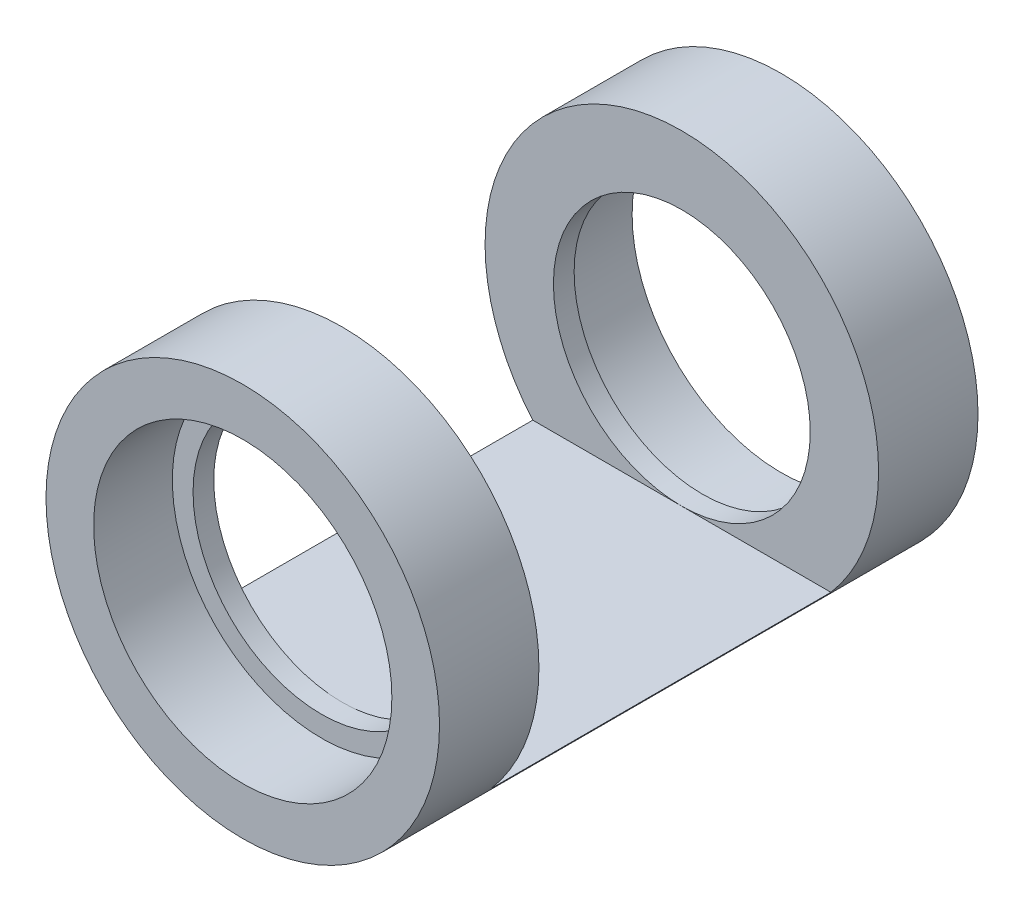
ISO-10303-21;
HEADER;
FILE_DESCRIPTION(('STEP AP214'),'2;1');
FILE_NAME('part.step','',(''),(''),'','','');
FILE_SCHEMA(('AUTOMOTIVE_DESIGN { 1 0 10303 214 1 1 1 1 }'));
ENDSEC;
DATA;
#1=APPLICATION_CONTEXT('core data for automotive mechanical design processes');
#2=APPLICATION_PROTOCOL_DEFINITION('international standard','automotive_design',2000,#1);
#3=PRODUCT_CONTEXT('',#1,'mechanical');
#4=PRODUCT('Part','Part','',(#3));
#5=PRODUCT_RELATED_PRODUCT_CATEGORY('part','',(#4));
#6=PRODUCT_DEFINITION_FORMATION('','',#4);
#7=PRODUCT_DEFINITION_CONTEXT('part definition',#1,'design');
#8=PRODUCT_DEFINITION('design','',#6,#7);
#9=PRODUCT_DEFINITION_SHAPE('','',#8);
#10=(LENGTH_UNIT() NAMED_UNIT(*) SI_UNIT(.MILLI.,.METRE.));
#11=(NAMED_UNIT(*) PLANE_ANGLE_UNIT() SI_UNIT($,.RADIAN.));
#12=(NAMED_UNIT(*) SI_UNIT($,.STERADIAN.) SOLID_ANGLE_UNIT());
#13=UNCERTAINTY_MEASURE_WITH_UNIT(LENGTH_MEASURE(1.E-05),#10,'distance_accuracy_value','');
#14=(GEOMETRIC_REPRESENTATION_CONTEXT(3) GLOBAL_UNCERTAINTY_ASSIGNED_CONTEXT((#13)) GLOBAL_UNIT_ASSIGNED_CONTEXT((#10,
#11,#12)) REPRESENTATION_CONTEXT('',''));
#15=CARTESIAN_POINT('',(0.,0.,0.));
#16=DIRECTION('',(0.,0.,1.));
#17=DIRECTION('',(1.,0.,0.));
#18=AXIS2_PLACEMENT_3D('',#15,#16,#17);
#19=CARTESIAN_POINT('',(0.,0.,65.));
#20=DIRECTION('',(0.,0.,-1.));
#21=DIRECTION('',(-1.,0.,0.));
#22=AXIS2_PLACEMENT_3D('',#19,#20,#21);
#23=CYLINDRICAL_SURFACE('',#22,31.);
#24=CARTESIAN_POINT('',(0.,0.,41.));
#25=DIRECTION('',(0.,0.,1.));
#26=DIRECTION('',(1.,0.,0.));
#27=AXIS2_PLACEMENT_3D('',#24,#25,#26);
#28=CIRCLE('',#27,31.);
#29=CARTESIAN_POINT('',(0.,-31.,41.));
#30=VERTEX_POINT('',#29);
#31=EDGE_CURVE('E57',#30,#30,#28,.T.);
#32=ORIENTED_EDGE('',*,*,#31,.F.);
#33=EDGE_LOOP('',(#32));
#34=FACE_BOUND('',#33,.T.);
#35=CARTESIAN_POINT('',(0.,0.,46.));
#36=DIRECTION('',(0.,0.,1.));
#37=DIRECTION('',(1.,0.,0.));
#38=AXIS2_PLACEMENT_3D('',#35,#36,#37);
#39=CIRCLE('',#38,31.);
#40=CARTESIAN_POINT('',(31.,0.,46.));
#41=VERTEX_POINT('',#40);
#42=EDGE_CURVE('E41',#41,#41,#39,.F.);
#43=ORIENTED_EDGE('',*,*,#42,.F.);
#44=EDGE_LOOP('',(#43));
#45=FACE_BOUND('',#44,.T.);
#46=ADVANCED_FACE('F37',(#34,#45),#23,.F.);
#47=CARTESIAN_POINT('',(0.,0.,65.));
#48=DIRECTION('',(0.,0.,-1.));
#49=DIRECTION('',(-1.,0.,0.));
#50=AXIS2_PLACEMENT_3D('',#47,#48,#49);
#51=CYLINDRICAL_SURFACE('',#50,47.5);
#52=CARTESIAN_POINT('',(0.,0.,-65.));
#53=DIRECTION('',(0.,0.,1.));
#54=DIRECTION('',(1.,0.,0.));
#55=AXIS2_PLACEMENT_3D('',#52,#53,#54);
#56=CIRCLE('',#55,47.5);
#57=CARTESIAN_POINT('',(47.5,0.,-65.));
#58=VERTEX_POINT('',#57);
#59=EDGE_CURVE('E46',#58,#58,#56,.T.);
#60=ORIENTED_EDGE('',*,*,#59,.T.);
#61=EDGE_LOOP('',(#60));
#62=FACE_BOUND('',#61,.T.);
#63=CARTESIAN_POINT('',(0.,0.,65.));
#64=DIRECTION('',(0.,0.,1.));
#65=DIRECTION('',(1.,0.,0.));
#66=AXIS2_PLACEMENT_3D('',#63,#64,#65);
#67=CIRCLE('',#66,47.5);
#68=CARTESIAN_POINT('',(47.5,0.,65.));
#69=VERTEX_POINT('',#68);
#70=EDGE_CURVE('E11',#69,#69,#67,.T.);
#71=ORIENTED_EDGE('',*,*,#70,.F.);
#72=EDGE_LOOP('',(#71));
#73=FACE_BOUND('',#72,.T.);
#74=CARTESIAN_POINT('',(0.,0.,-41.));
#75=DIRECTION('',(0.,0.,1.));
#76=DIRECTION('',(1.,0.,0.));
#77=AXIS2_PLACEMENT_3D('',#74,#75,#76);
#78=CIRCLE('',#77,47.5);
#79=CARTESIAN_POINT('',(35.9895818258562,-31.,-41.));
#80=VERTEX_POINT('',#79);
#81=CARTESIAN_POINT('',(-35.9895818258562,-31.,-41.));
#82=VERTEX_POINT('',#81);
#83=EDGE_CURVE('E72',#80,#82,#78,.T.);
#84=ORIENTED_EDGE('',*,*,#83,.F.);
#85=DIRECTION('',(0.,0.,1.));
#86=VECTOR('',#85,1.);
#87=CARTESIAN_POINT('',(35.9895818258562,-31.,-41.));
#88=LINE('',#87,#86);
#89=CARTESIAN_POINT('',(35.9895818258562,-31.,41.));
#90=VERTEX_POINT('',#89);
#91=EDGE_CURVE('E93',#80,#90,#88,.T.);
#92=ORIENTED_EDGE('',*,*,#91,.T.);
#93=CARTESIAN_POINT('',(0.,0.,41.));
#94=DIRECTION('',(0.,0.,1.));
#95=DIRECTION('',(1.,0.,0.));
#96=AXIS2_PLACEMENT_3D('',#93,#94,#95);
#97=CIRCLE('',#96,47.5);
#98=CARTESIAN_POINT('',(-35.9895818258562,-31.,41.));
#99=VERTEX_POINT('',#98);
#100=EDGE_CURVE('E92',#90,#99,#97,.T.);
#101=ORIENTED_EDGE('',*,*,#100,.T.);
#102=DIRECTION('',(0.,0.,1.));
#103=VECTOR('',#102,1.);
#104=CARTESIAN_POINT('',(-35.9895818258562,-31.,-41.));
#105=LINE('',#104,#103);
#106=EDGE_CURVE('E88',#82,#99,#105,.T.);
#107=ORIENTED_EDGE('',*,*,#106,.F.);
#108=EDGE_LOOP('',(#84,#92,#101,#107));
#109=FACE_BOUND('',#108,.T.);
#110=ADVANCED_FACE('F39',(#62,#73,#109),#51,.T.);
#111=CARTESIAN_POINT('',(0.,0.,65.));
#112=DIRECTION('',(0.,0.,1.));
#113=DIRECTION('',(1.,0.,0.));
#114=AXIS2_PLACEMENT_3D('',#111,#112,#113);
#115=PLANE('',#114);
#116=CARTESIAN_POINT('',(0.,0.,65.));
#117=DIRECTION('',(0.,0.,1.));
#118=DIRECTION('',(1.,0.,0.));
#119=AXIS2_PLACEMENT_3D('',#116,#117,#118);
#120=CIRCLE('',#119,36.);
#121=CARTESIAN_POINT('',(36.,0.,65.));
#122=VERTEX_POINT('',#121);
#123=EDGE_CURVE('E111',#122,#122,#120,.T.);
#124=ORIENTED_EDGE('',*,*,#123,.F.);
#125=EDGE_LOOP('',(#124));
#126=FACE_BOUND('',#125,.T.);
#127=ORIENTED_EDGE('',*,*,#70,.T.);
#128=EDGE_LOOP('',(#127));
#129=FACE_BOUND('',#128,.T.);
#130=ADVANCED_FACE('F139',(#126,#129),#115,.T.);
#131=CARTESIAN_POINT('',(0.,0.,-65.));
#132=DIRECTION('',(0.,0.,1.));
#133=DIRECTION('',(1.,0.,0.));
#134=AXIS2_PLACEMENT_3D('',#131,#132,#133);
#135=PLANE('',#134);
#136=CARTESIAN_POINT('',(0.,0.,-65.));
#137=DIRECTION('',(0.,0.,-1.));
#138=DIRECTION('',(-1.,0.,0.));
#139=AXIS2_PLACEMENT_3D('',#136,#137,#138);
#140=CIRCLE('',#139,36.);
#141=CARTESIAN_POINT('',(-36.,0.,-65.));
#142=VERTEX_POINT('',#141);
#143=EDGE_CURVE('E102',#142,#142,#140,.T.);
#144=ORIENTED_EDGE('',*,*,#143,.F.);
#145=EDGE_LOOP('',(#144));
#146=FACE_BOUND('',#145,.T.);
#147=ORIENTED_EDGE('',*,*,#59,.F.);
#148=EDGE_LOOP('',(#147));
#149=FACE_BOUND('',#148,.T.);
#150=ADVANCED_FACE('F161',(#146,#149),#135,.F.);
#151=CARTESIAN_POINT('',(-35.9895818258562,-31.,-41.));
#152=DIRECTION('',(0.,-1.,0.));
#153=DIRECTION('',(0.,0.,-1.));
#154=AXIS2_PLACEMENT_3D('',#151,#152,#153);
#155=PLANE('',#154);
#156=DIRECTION('',(1.,0.,0.));
#157=VECTOR('',#156,1.);
#158=CARTESIAN_POINT('',(-35.9895818258562,-31.,41.));
#159=LINE('',#158,#157);
#160=EDGE_CURVE('E82',#99,#30,#159,.T.);
#161=ORIENTED_EDGE('',*,*,#160,.T.);
#162=EDGE_CURVE('E119',#30,#90,#159,.T.);
#163=ORIENTED_EDGE('',*,*,#162,.T.);
#164=ORIENTED_EDGE('',*,*,#91,.F.);
#165=DIRECTION('',(1.,0.,0.));
#166=VECTOR('',#165,1.);
#167=CARTESIAN_POINT('',(-35.9895818258562,-31.,-41.));
#168=LINE('',#167,#166);
#169=CARTESIAN_POINT('',(0.,-31.,-41.));
#170=VERTEX_POINT('',#169);
#171=EDGE_CURVE('E77',#170,#80,#168,.T.);
#172=ORIENTED_EDGE('',*,*,#171,.F.);
#173=EDGE_CURVE('E75',#82,#170,#168,.T.);
#174=ORIENTED_EDGE('',*,*,#173,.F.);
#175=ORIENTED_EDGE('',*,*,#106,.T.);
#176=EDGE_LOOP('',(#161,#163,#164,#172,#174,#175));
#177=FACE_BOUND('',#176,.T.);
#178=ADVANCED_FACE('F87',(#177),#155,.F.);
#179=CARTESIAN_POINT('',(0.,0.,-41.));
#180=DIRECTION('',(0.,0.,1.));
#181=DIRECTION('',(1.,0.,0.));
#182=AXIS2_PLACEMENT_3D('',#179,#180,#181);
#183=PLANE('',#182);
#184=ORIENTED_EDGE('',*,*,#173,.T.);
#185=CARTESIAN_POINT('',(0.,0.,-41.));
#186=DIRECTION('',(0.,0.,1.));
#187=DIRECTION('',(1.,0.,0.));
#188=AXIS2_PLACEMENT_3D('',#185,#186,#187);
#189=CIRCLE('',#188,31.);
#190=EDGE_CURVE('E52',#170,#170,#189,.T.);
#191=ORIENTED_EDGE('',*,*,#190,.F.);
#192=ORIENTED_EDGE('',*,*,#171,.T.);
#193=ORIENTED_EDGE('',*,*,#83,.T.);
#194=EDGE_LOOP('',(#184,#191,#192,#193));
#195=FACE_BOUND('',#194,.T.);
#196=ADVANCED_FACE('F74',(#195),#183,.T.);
#197=CARTESIAN_POINT('',(0.,0.,41.));
#198=DIRECTION('',(0.,0.,1.));
#199=DIRECTION('',(1.,0.,0.));
#200=AXIS2_PLACEMENT_3D('',#197,#198,#199);
#201=PLANE('',#200);
#202=ORIENTED_EDGE('',*,*,#162,.F.);
#203=ORIENTED_EDGE('',*,*,#31,.T.);
#204=ORIENTED_EDGE('',*,*,#160,.F.);
#205=ORIENTED_EDGE('',*,*,#100,.F.);
#206=EDGE_LOOP('',(#202,#203,#204,#205));
#207=FACE_BOUND('',#206,.T.);
#208=ADVANCED_FACE('F120',(#207),#201,.F.);
#209=CARTESIAN_POINT('',(0.,0.,-46.));
#210=DIRECTION('',(0.,0.,-1.));
#211=DIRECTION('',(-1.,0.,0.));
#212=AXIS2_PLACEMENT_3D('',#209,#210,#211);
#213=CYLINDRICAL_SURFACE('',#212,36.);
#214=CARTESIAN_POINT('',(0.,0.,-46.));
#215=DIRECTION('',(0.,0.,-1.));
#216=DIRECTION('',(-1.,0.,0.));
#217=AXIS2_PLACEMENT_3D('',#214,#215,#216);
#218=CIRCLE('',#217,36.);
#219=CARTESIAN_POINT('',(-36.,0.,-46.));
#220=VERTEX_POINT('',#219);
#221=EDGE_CURVE('E114',#220,#220,#218,.T.);
#222=ORIENTED_EDGE('',*,*,#221,.F.);
#223=EDGE_LOOP('',(#222));
#224=FACE_BOUND('',#223,.T.);
#225=ORIENTED_EDGE('',*,*,#143,.T.);
#226=EDGE_LOOP('',(#225));
#227=FACE_BOUND('',#226,.T.);
#228=ADVANCED_FACE('F122',(#224,#227),#213,.F.);
#229=CARTESIAN_POINT('',(0.,0.,-46.));
#230=DIRECTION('',(0.,0.,-1.));
#231=DIRECTION('',(-1.,0.,0.));
#232=AXIS2_PLACEMENT_3D('',#229,#230,#231);
#233=PLANE('',#232);
#234=CARTESIAN_POINT('',(0.,0.,-46.));
#235=DIRECTION('',(0.,0.,-1.));
#236=DIRECTION('',(-1.,0.,0.));
#237=AXIS2_PLACEMENT_3D('',#234,#235,#236);
#238=CIRCLE('',#237,31.);
#239=CARTESIAN_POINT('',(-31.,0.,-46.));
#240=VERTEX_POINT('',#239);
#241=EDGE_CURVE('E99',#240,#240,#238,.T.);
#242=ORIENTED_EDGE('',*,*,#241,.F.);
#243=EDGE_LOOP('',(#242));
#244=FACE_BOUND('',#243,.T.);
#245=ORIENTED_EDGE('',*,*,#221,.T.);
#246=EDGE_LOOP('',(#245));
#247=FACE_BOUND('',#246,.T.);
#248=ADVANCED_FACE('F128',(#244,#247),#233,.T.);
#249=ORIENTED_EDGE('',*,*,#190,.T.);
#250=EDGE_LOOP('',(#249));
#251=FACE_BOUND('',#250,.T.);
#252=ORIENTED_EDGE('',*,*,#241,.T.);
#253=EDGE_LOOP('',(#252));
#254=FACE_BOUND('',#253,.T.);
#255=ADVANCED_FACE('F135',(#251,#254),#23,.F.);
#256=CARTESIAN_POINT('',(0.,0.,46.));
#257=DIRECTION('',(0.,0.,1.));
#258=DIRECTION('',(1.,0.,0.));
#259=AXIS2_PLACEMENT_3D('',#256,#257,#258);
#260=PLANE('',#259);
#261=CARTESIAN_POINT('',(0.,0.,46.));
#262=DIRECTION('',(0.,0.,1.));
#263=DIRECTION('',(1.,0.,0.));
#264=AXIS2_PLACEMENT_3D('',#261,#262,#263);
#265=CIRCLE('',#264,36.);
#266=CARTESIAN_POINT('',(36.,0.,46.));
#267=VERTEX_POINT('',#266);
#268=EDGE_CURVE('E109',#267,#267,#265,.T.);
#269=ORIENTED_EDGE('',*,*,#268,.T.);
#270=EDGE_LOOP('',(#269));
#271=FACE_BOUND('',#270,.T.);
#272=ORIENTED_EDGE('',*,*,#42,.T.);
#273=EDGE_LOOP('',(#272));
#274=FACE_BOUND('',#273,.T.);
#275=ADVANCED_FACE('F145',(#271,#274),#260,.T.);
#276=CARTESIAN_POINT('',(0.,0.,46.));
#277=DIRECTION('',(0.,0.,1.));
#278=DIRECTION('',(1.,0.,0.));
#279=AXIS2_PLACEMENT_3D('',#276,#277,#278);
#280=CYLINDRICAL_SURFACE('',#279,36.);
#281=ORIENTED_EDGE('',*,*,#268,.F.);
#282=EDGE_LOOP('',(#281));
#283=FACE_BOUND('',#282,.T.);
#284=ORIENTED_EDGE('',*,*,#123,.T.);
#285=EDGE_LOOP('',(#284));
#286=FACE_BOUND('',#285,.T.);
#287=ADVANCED_FACE('F150',(#283,#286),#280,.F.);
#288=CLOSED_SHELL('',(#46,#110,#130,#150,#178,#196,#208,#228,#248,#255,#275,#287));
#289=MANIFOLD_SOLID_BREP('B2',#288);
#290=ADVANCED_BREP_SHAPE_REPRESENTATION('',(#18,#289),#14);
#291=SHAPE_DEFINITION_REPRESENTATION(#9,#290);
ENDSEC;
END-ISO-10303-21;
